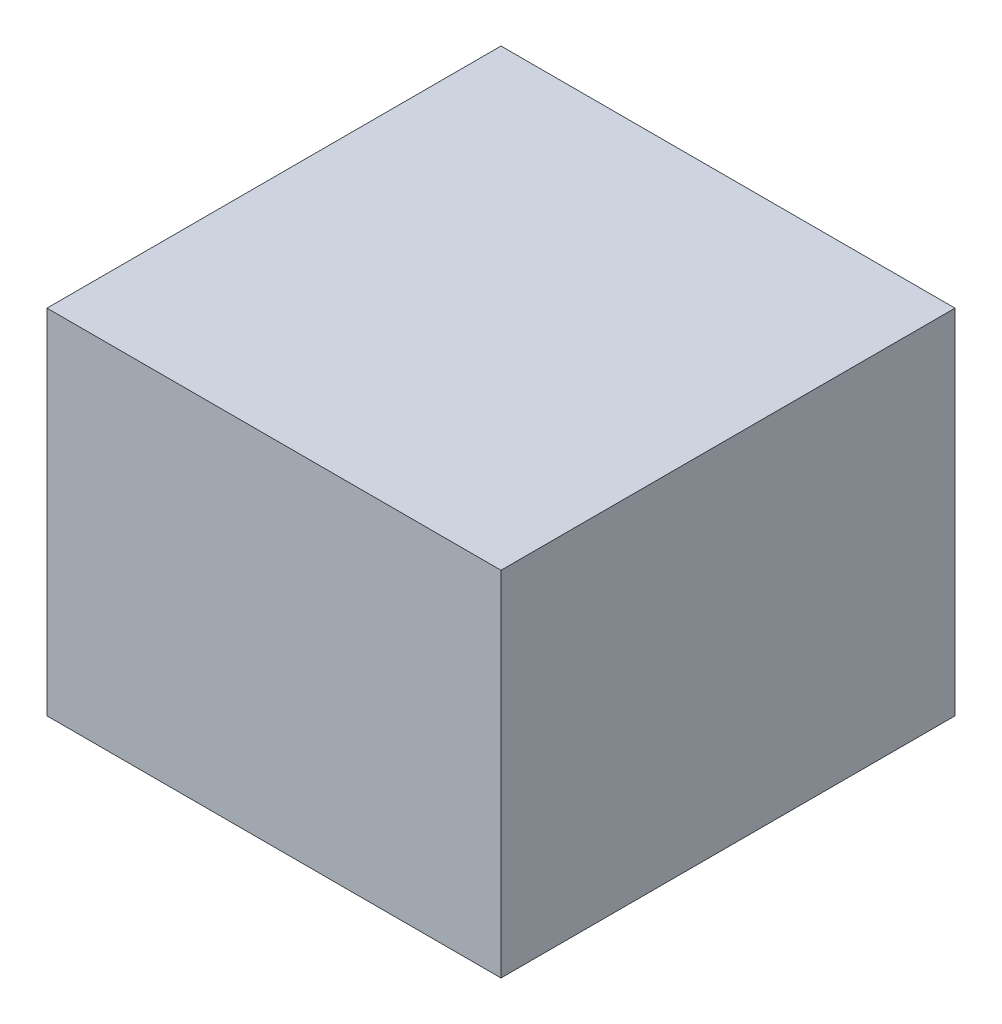
ISO-10303-21;
HEADER;
FILE_DESCRIPTION(('STEP AP214'),'2;1');
FILE_NAME('part.step','',(''),(''),'','','');
FILE_SCHEMA(('AUTOMOTIVE_DESIGN { 1 0 10303 214 1 1 1 1 }'));
ENDSEC;
DATA;
#1=APPLICATION_CONTEXT('core data for automotive mechanical design processes');
#2=APPLICATION_PROTOCOL_DEFINITION('international standard','automotive_design',2000,#1);
#3=PRODUCT_CONTEXT('',#1,'mechanical');
#4=PRODUCT('Part','Part','',(#3));
#5=PRODUCT_RELATED_PRODUCT_CATEGORY('part','',(#4));
#6=PRODUCT_DEFINITION_FORMATION('','',#4);
#7=PRODUCT_DEFINITION_CONTEXT('part definition',#1,'design');
#8=PRODUCT_DEFINITION('design','',#6,#7);
#9=PRODUCT_DEFINITION_SHAPE('','',#8);
#10=(LENGTH_UNIT() NAMED_UNIT(*) SI_UNIT(.MILLI.,.METRE.));
#11=(NAMED_UNIT(*) PLANE_ANGLE_UNIT() SI_UNIT($,.RADIAN.));
#12=(NAMED_UNIT(*) SI_UNIT($,.STERADIAN.) SOLID_ANGLE_UNIT());
#13=UNCERTAINTY_MEASURE_WITH_UNIT(LENGTH_MEASURE(1.E-05),#10,'distance_accuracy_value','');
#14=(GEOMETRIC_REPRESENTATION_CONTEXT(3) GLOBAL_UNCERTAINTY_ASSIGNED_CONTEXT((#13)) GLOBAL_UNIT_ASSIGNED_CONTEXT((#10,
#11,#12)) REPRESENTATION_CONTEXT('',''));
#15=CARTESIAN_POINT('',(0.,0.,0.));
#16=DIRECTION('',(0.,0.,1.));
#17=DIRECTION('',(1.,0.,0.));
#18=AXIS2_PLACEMENT_3D('',#15,#16,#17);
#19=CARTESIAN_POINT('',(0.,44.45,0.));
#20=DIRECTION('',(1.,0.,0.));
#21=DIRECTION('',(0.,0.,-1.));
#22=AXIS2_PLACEMENT_3D('',#19,#20,#21);
#23=PLANE('',#22);
#24=DIRECTION('',(0.,0.,1.));
#25=VECTOR('',#24,1.);
#26=CARTESIAN_POINT('',(0.,0.,0.));
#27=LINE('',#26,#25);
#28=CARTESIAN_POINT('',(0.,0.,-57.15));
#29=VERTEX_POINT('',#28);
#30=CARTESIAN_POINT('',(0.,0.,0.));
#31=VERTEX_POINT('',#30);
#32=EDGE_CURVE('E111',#29,#31,#27,.T.);
#33=ORIENTED_EDGE('',*,*,#32,.T.);
#34=DIRECTION('',(0.,-1.,0.));
#35=VECTOR('',#34,1.);
#36=CARTESIAN_POINT('',(0.,44.45,0.));
#37=LINE('',#36,#35);
#38=CARTESIAN_POINT('',(0.,44.45,0.));
#39=VERTEX_POINT('',#38);
#40=EDGE_CURVE('E11',#39,#31,#37,.T.);
#41=ORIENTED_EDGE('',*,*,#40,.F.);
#42=DIRECTION('',(0.,0.,1.));
#43=VECTOR('',#42,1.);
#44=CARTESIAN_POINT('',(0.,44.45,0.));
#45=LINE('',#44,#43);
#46=CARTESIAN_POINT('',(0.,44.45,-57.15));
#47=VERTEX_POINT('',#46);
#48=EDGE_CURVE('E95',#47,#39,#45,.T.);
#49=ORIENTED_EDGE('',*,*,#48,.F.);
#50=DIRECTION('',(0.,-1.,0.));
#51=VECTOR('',#50,1.);
#52=CARTESIAN_POINT('',(0.,44.45,-57.15));
#53=LINE('',#52,#51);
#54=EDGE_CURVE('E107',#47,#29,#53,.T.);
#55=ORIENTED_EDGE('',*,*,#54,.T.);
#56=EDGE_LOOP('',(#33,#41,#49,#55));
#57=FACE_BOUND('',#56,.T.);
#58=ADVANCED_FACE('F43',(#57),#23,.F.);
#59=CARTESIAN_POINT('',(0.,44.45,0.));
#60=DIRECTION('',(0.,0.,-1.));
#61=DIRECTION('',(-1.,0.,0.));
#62=AXIS2_PLACEMENT_3D('',#59,#60,#61);
#63=PLANE('',#62);
#64=DIRECTION('',(1.,0.,0.));
#65=VECTOR('',#64,1.);
#66=CARTESIAN_POINT('',(0.,0.,0.));
#67=LINE('',#66,#65);
#68=CARTESIAN_POINT('',(57.15,0.,0.));
#69=VERTEX_POINT('',#68);
#70=EDGE_CURVE('E100',#31,#69,#67,.T.);
#71=ORIENTED_EDGE('',*,*,#70,.T.);
#72=DIRECTION('',(0.,-1.,0.));
#73=VECTOR('',#72,1.);
#74=CARTESIAN_POINT('',(57.15,44.45,0.));
#75=LINE('',#74,#73);
#76=CARTESIAN_POINT('',(57.15,44.45,0.));
#77=VERTEX_POINT('',#76);
#78=EDGE_CURVE('E52',#77,#69,#75,.T.);
#79=ORIENTED_EDGE('',*,*,#78,.F.);
#80=DIRECTION('',(1.,0.,0.));
#81=VECTOR('',#80,1.);
#82=CARTESIAN_POINT('',(0.,44.45,0.));
#83=LINE('',#82,#81);
#84=EDGE_CURVE('E90',#39,#77,#83,.T.);
#85=ORIENTED_EDGE('',*,*,#84,.F.);
#86=ORIENTED_EDGE('',*,*,#40,.T.);
#87=EDGE_LOOP('',(#71,#79,#85,#86));
#88=FACE_BOUND('',#87,.T.);
#89=ADVANCED_FACE('F99',(#88),#63,.F.);
#90=CARTESIAN_POINT('',(57.15,44.45,0.));
#91=DIRECTION('',(-1.,0.,0.));
#92=DIRECTION('',(0.,0.,1.));
#93=AXIS2_PLACEMENT_3D('',#90,#91,#92);
#94=PLANE('',#93);
#95=DIRECTION('',(0.,0.,-1.));
#96=VECTOR('',#95,1.);
#97=CARTESIAN_POINT('',(57.15,0.,0.));
#98=LINE('',#97,#96);
#99=CARTESIAN_POINT('',(57.15,0.,-57.15));
#100=VERTEX_POINT('',#99);
#101=EDGE_CURVE('E77',#69,#100,#98,.T.);
#102=ORIENTED_EDGE('',*,*,#101,.T.);
#103=DIRECTION('',(0.,-1.,0.));
#104=VECTOR('',#103,1.);
#105=CARTESIAN_POINT('',(57.15,44.45,-57.15));
#106=LINE('',#105,#104);
#107=CARTESIAN_POINT('',(57.15,44.45,-57.15));
#108=VERTEX_POINT('',#107);
#109=EDGE_CURVE('E102',#108,#100,#106,.T.);
#110=ORIENTED_EDGE('',*,*,#109,.F.);
#111=DIRECTION('',(0.,0.,-1.));
#112=VECTOR('',#111,1.);
#113=CARTESIAN_POINT('',(57.15,44.45,0.));
#114=LINE('',#113,#112);
#115=EDGE_CURVE('E93',#77,#108,#114,.T.);
#116=ORIENTED_EDGE('',*,*,#115,.F.);
#117=ORIENTED_EDGE('',*,*,#78,.T.);
#118=EDGE_LOOP('',(#102,#110,#116,#117));
#119=FACE_BOUND('',#118,.T.);
#120=ADVANCED_FACE('F103',(#119),#94,.F.);
#121=CARTESIAN_POINT('',(0.,44.45,-57.15));
#122=DIRECTION('',(0.,0.,1.));
#123=DIRECTION('',(1.,0.,0.));
#124=AXIS2_PLACEMENT_3D('',#121,#122,#123);
#125=PLANE('',#124);
#126=DIRECTION('',(-1.,0.,0.));
#127=VECTOR('',#126,1.);
#128=CARTESIAN_POINT('',(0.,0.,-57.15));
#129=LINE('',#128,#127);
#130=EDGE_CURVE('E83',#100,#29,#129,.T.);
#131=ORIENTED_EDGE('',*,*,#130,.T.);
#132=ORIENTED_EDGE('',*,*,#54,.F.);
#133=DIRECTION('',(-1.,0.,0.));
#134=VECTOR('',#133,1.);
#135=CARTESIAN_POINT('',(0.,44.45,-57.15));
#136=LINE('',#135,#134);
#137=EDGE_CURVE('E60',#108,#47,#136,.T.);
#138=ORIENTED_EDGE('',*,*,#137,.F.);
#139=ORIENTED_EDGE('',*,*,#109,.T.);
#140=EDGE_LOOP('',(#131,#132,#138,#139));
#141=FACE_BOUND('',#140,.T.);
#142=ADVANCED_FACE('F124',(#141),#125,.F.);
#143=CARTESIAN_POINT('',(0.,44.45,0.));
#144=DIRECTION('',(0.,-1.,0.));
#145=DIRECTION('',(0.,0.,-1.));
#146=AXIS2_PLACEMENT_3D('',#143,#144,#145);
#147=PLANE('',#146);
#148=ORIENTED_EDGE('',*,*,#48,.T.);
#149=ORIENTED_EDGE('',*,*,#84,.T.);
#150=ORIENTED_EDGE('',*,*,#115,.T.);
#151=ORIENTED_EDGE('',*,*,#137,.T.);
#152=EDGE_LOOP('',(#148,#149,#150,#151));
#153=FACE_BOUND('',#152,.T.);
#154=ADVANCED_FACE('F91',(#153),#147,.F.);
#155=CARTESIAN_POINT('',(0.,0.,0.));
#156=DIRECTION('',(0.,-1.,0.));
#157=DIRECTION('',(0.,0.,-1.));
#158=AXIS2_PLACEMENT_3D('',#155,#156,#157);
#159=PLANE('',#158);
#160=ORIENTED_EDGE('',*,*,#32,.F.);
#161=ORIENTED_EDGE('',*,*,#130,.F.);
#162=ORIENTED_EDGE('',*,*,#101,.F.);
#163=ORIENTED_EDGE('',*,*,#70,.F.);
#164=EDGE_LOOP('',(#160,#161,#162,#163));
#165=FACE_BOUND('',#164,.T.);
#166=ADVANCED_FACE('F127',(#165),#159,.T.);
#167=CLOSED_SHELL('',(#58,#89,#120,#142,#154,#166));
#168=MANIFOLD_SOLID_BREP('B2',#167);
#169=ADVANCED_BREP_SHAPE_REPRESENTATION('',(#18,#168),#14);
#170=SHAPE_DEFINITION_REPRESENTATION(#9,#169);
ENDSEC;
END-ISO-10303-21;
